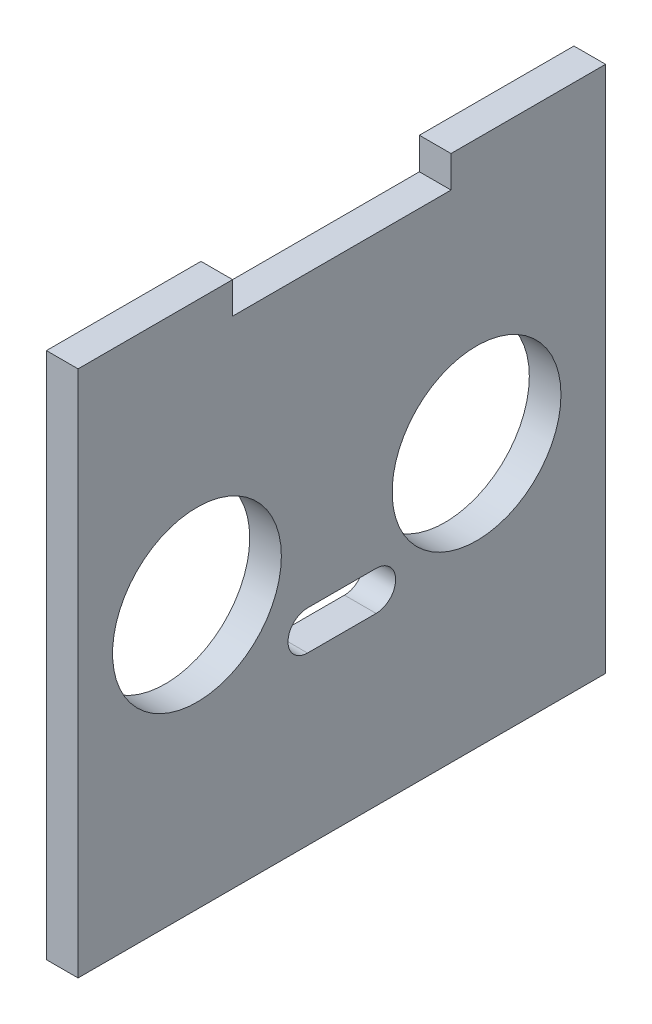
ISO-10303-21;
HEADER;
FILE_DESCRIPTION(('STEP AP214'),'2;1');
FILE_NAME('part.step','',(''),(''),'','','');
FILE_SCHEMA(('AUTOMOTIVE_DESIGN { 1 0 10303 214 1 1 1 1 }'));
ENDSEC;
DATA;
#1=APPLICATION_CONTEXT('core data for automotive mechanical design processes');
#2=APPLICATION_PROTOCOL_DEFINITION('international standard','automotive_design',2000,#1);
#3=PRODUCT_CONTEXT('',#1,'mechanical');
#4=PRODUCT('Part','Part','',(#3));
#5=PRODUCT_RELATED_PRODUCT_CATEGORY('part','',(#4));
#6=PRODUCT_DEFINITION_FORMATION('','',#4);
#7=PRODUCT_DEFINITION_CONTEXT('part definition',#1,'design');
#8=PRODUCT_DEFINITION('design','',#6,#7);
#9=PRODUCT_DEFINITION_SHAPE('','',#8);
#10=(LENGTH_UNIT() NAMED_UNIT(*) SI_UNIT(.MILLI.,.METRE.));
#11=(NAMED_UNIT(*) PLANE_ANGLE_UNIT() SI_UNIT($,.RADIAN.));
#12=(NAMED_UNIT(*) SI_UNIT($,.STERADIAN.) SOLID_ANGLE_UNIT());
#13=UNCERTAINTY_MEASURE_WITH_UNIT(LENGTH_MEASURE(1.E-05),#10,'distance_accuracy_value','');
#14=(GEOMETRIC_REPRESENTATION_CONTEXT(3) GLOBAL_UNCERTAINTY_ASSIGNED_CONTEXT((#13)) GLOBAL_UNIT_ASSIGNED_CONTEXT((#10,
#11,#12)) REPRESENTATION_CONTEXT('',''));
#15=CARTESIAN_POINT('',(0.,0.,0.));
#16=DIRECTION('',(0.,0.,1.));
#17=DIRECTION('',(1.,0.,0.));
#18=AXIS2_PLACEMENT_3D('',#15,#16,#17);
#19=CARTESIAN_POINT('',(3.,25.,-25.));
#20=DIRECTION('',(0.,0.,1.));
#21=DIRECTION('',(1.,0.,0.));
#22=AXIS2_PLACEMENT_3D('',#19,#20,#21);
#23=PLANE('',#22);
#24=DIRECTION('',(0.,1.,0.));
#25=VECTOR('',#24,1.);
#26=CARTESIAN_POINT('',(0.,25.,-25.));
#27=LINE('',#26,#25);
#28=CARTESIAN_POINT('',(0.,-25.,-25.));
#29=VERTEX_POINT('',#28);
#30=CARTESIAN_POINT('',(0.,25.,-25.));
#31=VERTEX_POINT('',#30);
#32=EDGE_CURVE('E185',#29,#31,#27,.T.);
#33=ORIENTED_EDGE('',*,*,#32,.T.);
#34=DIRECTION('',(-1.,0.,0.));
#35=VECTOR('',#34,1.);
#36=CARTESIAN_POINT('',(3.,25.,-25.));
#37=LINE('',#36,#35);
#38=CARTESIAN_POINT('',(3.,25.,-25.));
#39=VERTEX_POINT('',#38);
#40=EDGE_CURVE('E11',#39,#31,#37,.T.);
#41=ORIENTED_EDGE('',*,*,#40,.F.);
#42=DIRECTION('',(0.,1.,0.));
#43=VECTOR('',#42,1.);
#44=CARTESIAN_POINT('',(3.,25.,-25.));
#45=LINE('',#44,#43);
#46=CARTESIAN_POINT('',(3.,-25.,-25.));
#47=VERTEX_POINT('',#46);
#48=EDGE_CURVE('E166',#47,#39,#45,.T.);
#49=ORIENTED_EDGE('',*,*,#48,.F.);
#50=DIRECTION('',(-1.,0.,0.));
#51=VECTOR('',#50,1.);
#52=CARTESIAN_POINT('',(3.,-25.,-25.));
#53=LINE('',#52,#51);
#54=EDGE_CURVE('E184',#47,#29,#53,.T.);
#55=ORIENTED_EDGE('',*,*,#54,.T.);
#56=EDGE_LOOP('',(#33,#41,#49,#55));
#57=FACE_BOUND('',#56,.T.);
#58=ADVANCED_FACE('F33',(#57),#23,.F.);
#59=CARTESIAN_POINT('',(3.,25.,-10.35));
#60=DIRECTION('',(0.,-1.,0.));
#61=DIRECTION('',(0.,0.,-1.));
#62=AXIS2_PLACEMENT_3D('',#59,#60,#61);
#63=PLANE('',#62);
#64=DIRECTION('',(0.,0.,1.));
#65=VECTOR('',#64,1.);
#66=CARTESIAN_POINT('',(0.,25.,-10.35));
#67=LINE('',#66,#65);
#68=CARTESIAN_POINT('',(0.,25.,-10.35));
#69=VERTEX_POINT('',#68);
#70=EDGE_CURVE('E188',#31,#69,#67,.T.);
#71=ORIENTED_EDGE('',*,*,#70,.T.);
#72=DIRECTION('',(-1.,0.,0.));
#73=VECTOR('',#72,1.);
#74=CARTESIAN_POINT('',(3.,25.,-10.35));
#75=LINE('',#74,#73);
#76=CARTESIAN_POINT('',(3.,25.,-10.35));
#77=VERTEX_POINT('',#76);
#78=EDGE_CURVE('E40',#77,#69,#75,.T.);
#79=ORIENTED_EDGE('',*,*,#78,.F.);
#80=DIRECTION('',(0.,0.,1.));
#81=VECTOR('',#80,1.);
#82=CARTESIAN_POINT('',(3.,25.,-10.35));
#83=LINE('',#82,#81);
#84=EDGE_CURVE('E169',#39,#77,#83,.T.);
#85=ORIENTED_EDGE('',*,*,#84,.F.);
#86=ORIENTED_EDGE('',*,*,#40,.T.);
#87=EDGE_LOOP('',(#71,#79,#85,#86));
#88=FACE_BOUND('',#87,.T.);
#89=ADVANCED_FACE('F245',(#88),#63,.F.);
#90=CARTESIAN_POINT('',(3.,22.,-10.35));
#91=DIRECTION('',(0.,0.,-1.));
#92=DIRECTION('',(0.,1.,0.));
#93=AXIS2_PLACEMENT_3D('',#90,#91,#92);
#94=PLANE('',#93);
#95=DIRECTION('',(0.,-1.,0.));
#96=VECTOR('',#95,1.);
#97=CARTESIAN_POINT('',(0.,22.,-10.35));
#98=LINE('',#97,#96);
#99=CARTESIAN_POINT('',(0.,22.,-10.35));
#100=VERTEX_POINT('',#99);
#101=EDGE_CURVE('E191',#69,#100,#98,.T.);
#102=ORIENTED_EDGE('',*,*,#101,.T.);
#103=DIRECTION('',(-1.,0.,0.));
#104=VECTOR('',#103,1.);
#105=CARTESIAN_POINT('',(3.,22.,-10.35));
#106=LINE('',#105,#104);
#107=CARTESIAN_POINT('',(3.,22.,-10.35));
#108=VERTEX_POINT('',#107);
#109=EDGE_CURVE('E216',#108,#100,#106,.T.);
#110=ORIENTED_EDGE('',*,*,#109,.F.);
#111=DIRECTION('',(0.,-1.,0.));
#112=VECTOR('',#111,1.);
#113=CARTESIAN_POINT('',(3.,22.,-10.35));
#114=LINE('',#113,#112);
#115=EDGE_CURVE('E172',#77,#108,#114,.T.);
#116=ORIENTED_EDGE('',*,*,#115,.F.);
#117=ORIENTED_EDGE('',*,*,#78,.T.);
#118=EDGE_LOOP('',(#102,#110,#116,#117));
#119=FACE_BOUND('',#118,.T.);
#120=ADVANCED_FACE('F223',(#119),#94,.F.);
#121=CARTESIAN_POINT('',(3.,22.,10.35));
#122=DIRECTION('',(0.,-1.,0.));
#123=DIRECTION('',(0.,0.,-1.));
#124=AXIS2_PLACEMENT_3D('',#121,#122,#123);
#125=PLANE('',#124);
#126=DIRECTION('',(0.,0.,1.));
#127=VECTOR('',#126,1.);
#128=CARTESIAN_POINT('',(0.,22.,10.35));
#129=LINE('',#128,#127);
#130=CARTESIAN_POINT('',(0.,22.,10.35));
#131=VERTEX_POINT('',#130);
#132=EDGE_CURVE('E193',#100,#131,#129,.T.);
#133=ORIENTED_EDGE('',*,*,#132,.T.);
#134=DIRECTION('',(-1.,0.,0.));
#135=VECTOR('',#134,1.);
#136=CARTESIAN_POINT('',(3.,22.,10.35));
#137=LINE('',#136,#135);
#138=CARTESIAN_POINT('',(3.,22.,10.35));
#139=VERTEX_POINT('',#138);
#140=EDGE_CURVE('E213',#139,#131,#137,.T.);
#141=ORIENTED_EDGE('',*,*,#140,.F.);
#142=DIRECTION('',(0.,0.,1.));
#143=VECTOR('',#142,1.);
#144=CARTESIAN_POINT('',(3.,22.,10.35));
#145=LINE('',#144,#143);
#146=EDGE_CURVE('E174',#108,#139,#145,.T.);
#147=ORIENTED_EDGE('',*,*,#146,.F.);
#148=ORIENTED_EDGE('',*,*,#109,.T.);
#149=EDGE_LOOP('',(#133,#141,#147,#148));
#150=FACE_BOUND('',#149,.T.);
#151=ADVANCED_FACE('F233',(#150),#125,.F.);
#152=CARTESIAN_POINT('',(3.,25.,10.35));
#153=DIRECTION('',(0.,0.,1.));
#154=DIRECTION('',(0.,-1.,0.));
#155=AXIS2_PLACEMENT_3D('',#152,#153,#154);
#156=PLANE('',#155);
#157=DIRECTION('',(0.,1.,0.));
#158=VECTOR('',#157,1.);
#159=CARTESIAN_POINT('',(0.,25.,10.35));
#160=LINE('',#159,#158);
#161=CARTESIAN_POINT('',(0.,25.,10.35));
#162=VERTEX_POINT('',#161);
#163=EDGE_CURVE('E195',#131,#162,#160,.T.);
#164=ORIENTED_EDGE('',*,*,#163,.T.);
#165=DIRECTION('',(-1.,0.,0.));
#166=VECTOR('',#165,1.);
#167=CARTESIAN_POINT('',(3.,25.,10.35));
#168=LINE('',#167,#166);
#169=CARTESIAN_POINT('',(3.,25.,10.35));
#170=VERTEX_POINT('',#169);
#171=EDGE_CURVE('E210',#170,#162,#168,.T.);
#172=ORIENTED_EDGE('',*,*,#171,.F.);
#173=DIRECTION('',(0.,1.,0.));
#174=VECTOR('',#173,1.);
#175=CARTESIAN_POINT('',(3.,25.,10.35));
#176=LINE('',#175,#174);
#177=EDGE_CURVE('E176',#139,#170,#176,.T.);
#178=ORIENTED_EDGE('',*,*,#177,.F.);
#179=ORIENTED_EDGE('',*,*,#140,.T.);
#180=EDGE_LOOP('',(#164,#172,#178,#179));
#181=FACE_BOUND('',#180,.T.);
#182=ADVANCED_FACE('F237',(#181),#156,.F.);
#183=CARTESIAN_POINT('',(3.,25.,25.));
#184=DIRECTION('',(0.,-1.,0.));
#185=DIRECTION('',(0.,0.,-1.));
#186=AXIS2_PLACEMENT_3D('',#183,#184,#185);
#187=PLANE('',#186);
#188=DIRECTION('',(0.,0.,1.));
#189=VECTOR('',#188,1.);
#190=CARTESIAN_POINT('',(0.,25.,25.));
#191=LINE('',#190,#189);
#192=CARTESIAN_POINT('',(0.,25.,25.));
#193=VERTEX_POINT('',#192);
#194=EDGE_CURVE('E197',#162,#193,#191,.T.);
#195=ORIENTED_EDGE('',*,*,#194,.T.);
#196=DIRECTION('',(-1.,0.,0.));
#197=VECTOR('',#196,1.);
#198=CARTESIAN_POINT('',(3.,25.,25.));
#199=LINE('',#198,#197);
#200=CARTESIAN_POINT('',(3.,25.,25.));
#201=VERTEX_POINT('',#200);
#202=EDGE_CURVE('E207',#201,#193,#199,.T.);
#203=ORIENTED_EDGE('',*,*,#202,.F.);
#204=DIRECTION('',(0.,0.,1.));
#205=VECTOR('',#204,1.);
#206=CARTESIAN_POINT('',(3.,25.,25.));
#207=LINE('',#206,#205);
#208=EDGE_CURVE('E178',#170,#201,#207,.T.);
#209=ORIENTED_EDGE('',*,*,#208,.F.);
#210=ORIENTED_EDGE('',*,*,#171,.T.);
#211=EDGE_LOOP('',(#195,#203,#209,#210));
#212=FACE_BOUND('',#211,.T.);
#213=ADVANCED_FACE('F258',(#212),#187,.F.);
#214=CARTESIAN_POINT('',(3.,25.,25.));
#215=DIRECTION('',(0.,0.,-1.));
#216=DIRECTION('',(-1.,0.,0.));
#217=AXIS2_PLACEMENT_3D('',#214,#215,#216);
#218=PLANE('',#217);
#219=DIRECTION('',(0.,-1.,0.));
#220=VECTOR('',#219,1.);
#221=CARTESIAN_POINT('',(0.,25.,25.));
#222=LINE('',#221,#220);
#223=CARTESIAN_POINT('',(0.,-25.,25.));
#224=VERTEX_POINT('',#223);
#225=EDGE_CURVE('E199',#193,#224,#222,.T.);
#226=ORIENTED_EDGE('',*,*,#225,.T.);
#227=DIRECTION('',(-1.,0.,0.));
#228=VECTOR('',#227,1.);
#229=CARTESIAN_POINT('',(3.,-25.,25.));
#230=LINE('',#229,#228);
#231=CARTESIAN_POINT('',(3.,-25.,25.));
#232=VERTEX_POINT('',#231);
#233=EDGE_CURVE('E204',#232,#224,#230,.T.);
#234=ORIENTED_EDGE('',*,*,#233,.F.);
#235=DIRECTION('',(0.,-1.,0.));
#236=VECTOR('',#235,1.);
#237=CARTESIAN_POINT('',(3.,25.,25.));
#238=LINE('',#237,#236);
#239=EDGE_CURVE('E180',#201,#232,#238,.T.);
#240=ORIENTED_EDGE('',*,*,#239,.F.);
#241=ORIENTED_EDGE('',*,*,#202,.T.);
#242=EDGE_LOOP('',(#226,#234,#240,#241));
#243=FACE_BOUND('',#242,.T.);
#244=ADVANCED_FACE('F256',(#243),#218,.F.);
#245=CARTESIAN_POINT('',(3.,-25.,25.));
#246=DIRECTION('',(0.,1.,0.));
#247=DIRECTION('',(0.,0.,1.));
#248=AXIS2_PLACEMENT_3D('',#245,#246,#247);
#249=PLANE('',#248);
#250=DIRECTION('',(0.,0.,-1.));
#251=VECTOR('',#250,1.);
#252=CARTESIAN_POINT('',(0.,-25.,25.));
#253=LINE('',#252,#251);
#254=EDGE_CURVE('E170',#224,#29,#253,.T.);
#255=ORIENTED_EDGE('',*,*,#254,.T.);
#256=ORIENTED_EDGE('',*,*,#54,.F.);
#257=DIRECTION('',(0.,0.,-1.));
#258=VECTOR('',#257,1.);
#259=CARTESIAN_POINT('',(3.,-25.,25.));
#260=LINE('',#259,#258);
#261=EDGE_CURVE('E182',#232,#47,#260,.T.);
#262=ORIENTED_EDGE('',*,*,#261,.F.);
#263=ORIENTED_EDGE('',*,*,#233,.T.);
#264=EDGE_LOOP('',(#255,#256,#262,#263));
#265=FACE_BOUND('',#264,.T.);
#266=ADVANCED_FACE('F251',(#265),#249,.F.);
#267=CARTESIAN_POINT('',(3.,0.,0.));
#268=DIRECTION('',(1.,0.,0.));
#269=DIRECTION('',(0.,0.,-1.));
#270=AXIS2_PLACEMENT_3D('',#267,#268,#269);
#271=PLANE('',#270);
#272=CARTESIAN_POINT('',(3.,0.,13.73));
#273=DIRECTION('',(1.,0.,0.));
#274=DIRECTION('',(0.,0.,-1.));
#275=AXIS2_PLACEMENT_3D('',#272,#273,#274);
#276=CIRCLE('',#275,8.);
#277=CARTESIAN_POINT('',(3.,0.,5.73));
#278=VERTEX_POINT('',#277);
#279=EDGE_CURVE('E145',#278,#278,#276,.T.);
#280=ORIENTED_EDGE('',*,*,#279,.F.);
#281=EDGE_LOOP('',(#280));
#282=FACE_BOUND('',#281,.T.);
#283=CARTESIAN_POINT('',(3.,-7.35,3.25));
#284=DIRECTION('',(1.,0.,0.));
#285=DIRECTION('',(0.,0.,-1.));
#286=AXIS2_PLACEMENT_3D('',#283,#284,#285);
#287=CIRCLE('',#286,1.85);
#288=CARTESIAN_POINT('',(3.,-5.5,3.25));
#289=VERTEX_POINT('',#288);
#290=CARTESIAN_POINT('',(3.,-9.2,3.25));
#291=VERTEX_POINT('',#290);
#292=EDGE_CURVE('E47',#289,#291,#287,.T.);
#293=ORIENTED_EDGE('',*,*,#292,.F.);
#294=DIRECTION('',(0.,0.,1.));
#295=VECTOR('',#294,1.);
#296=CARTESIAN_POINT('',(3.,-5.5,3.25));
#297=LINE('',#296,#295);
#298=CARTESIAN_POINT('',(3.,-5.5,-3.25));
#299=VERTEX_POINT('',#298);
#300=EDGE_CURVE('E139',#299,#289,#297,.T.);
#301=ORIENTED_EDGE('',*,*,#300,.F.);
#302=CARTESIAN_POINT('',(3.,-7.35,-3.25));
#303=DIRECTION('',(1.,0.,0.));
#304=DIRECTION('',(0.,0.,-1.));
#305=AXIS2_PLACEMENT_3D('',#302,#303,#304);
#306=CIRCLE('',#305,1.85);
#307=CARTESIAN_POINT('',(3.,-9.2,-3.25));
#308=VERTEX_POINT('',#307);
#309=EDGE_CURVE('E142',#308,#299,#306,.T.);
#310=ORIENTED_EDGE('',*,*,#309,.F.);
#311=DIRECTION('',(0.,0.,-1.));
#312=VECTOR('',#311,1.);
#313=CARTESIAN_POINT('',(3.,-9.2,3.25));
#314=LINE('',#313,#312);
#315=EDGE_CURVE('E151',#291,#308,#314,.T.);
#316=ORIENTED_EDGE('',*,*,#315,.F.);
#317=EDGE_LOOP('',(#293,#301,#310,#316));
#318=FACE_BOUND('',#317,.T.);
#319=CARTESIAN_POINT('',(3.,0.,-12.77));
#320=DIRECTION('',(1.,0.,0.));
#321=DIRECTION('',(0.,0.,-1.));
#322=AXIS2_PLACEMENT_3D('',#319,#320,#321);
#323=CIRCLE('',#322,8.);
#324=CARTESIAN_POINT('',(3.,0.,-20.77));
#325=VERTEX_POINT('',#324);
#326=EDGE_CURVE('E157',#325,#325,#323,.T.);
#327=ORIENTED_EDGE('',*,*,#326,.F.);
#328=EDGE_LOOP('',(#327));
#329=FACE_BOUND('',#328,.T.);
#330=ORIENTED_EDGE('',*,*,#48,.T.);
#331=ORIENTED_EDGE('',*,*,#84,.T.);
#332=ORIENTED_EDGE('',*,*,#115,.T.);
#333=ORIENTED_EDGE('',*,*,#146,.T.);
#334=ORIENTED_EDGE('',*,*,#177,.T.);
#335=ORIENTED_EDGE('',*,*,#208,.T.);
#336=ORIENTED_EDGE('',*,*,#239,.T.);
#337=ORIENTED_EDGE('',*,*,#261,.T.);
#338=EDGE_LOOP('',(#330,#331,#332,#333,#334,#335,#336,#337));
#339=FACE_BOUND('',#338,.T.);
#340=ADVANCED_FACE('F241',(#282,#318,#329,#339),#271,.T.);
#341=CARTESIAN_POINT('',(0.,0.,0.));
#342=DIRECTION('',(1.,0.,0.));
#343=DIRECTION('',(0.,0.,-1.));
#344=AXIS2_PLACEMENT_3D('',#341,#342,#343);
#345=PLANE('',#344);
#346=CARTESIAN_POINT('',(0.,0.,13.73));
#347=DIRECTION('',(1.,0.,0.));
#348=DIRECTION('',(0.,0.,-1.));
#349=AXIS2_PLACEMENT_3D('',#346,#347,#348);
#350=CIRCLE('',#349,8.);
#351=CARTESIAN_POINT('',(0.,0.,5.73));
#352=VERTEX_POINT('',#351);
#353=EDGE_CURVE('E189',#352,#352,#350,.T.);
#354=ORIENTED_EDGE('',*,*,#353,.T.);
#355=EDGE_LOOP('',(#354));
#356=FACE_BOUND('',#355,.T.);
#357=DIRECTION('',(0.,0.,1.));
#358=VECTOR('',#357,1.);
#359=CARTESIAN_POINT('',(0.,-5.5,3.25));
#360=LINE('',#359,#358);
#361=CARTESIAN_POINT('',(0.,-5.5,-3.25));
#362=VERTEX_POINT('',#361);
#363=CARTESIAN_POINT('',(0.,-5.5,3.25));
#364=VERTEX_POINT('',#363);
#365=EDGE_CURVE('E129',#362,#364,#360,.T.);
#366=ORIENTED_EDGE('',*,*,#365,.T.);
#367=CARTESIAN_POINT('',(0.,-7.35,3.25));
#368=DIRECTION('',(1.,0.,0.));
#369=DIRECTION('',(0.,0.,-1.));
#370=AXIS2_PLACEMENT_3D('',#367,#368,#369);
#371=CIRCLE('',#370,1.85);
#372=CARTESIAN_POINT('',(0.,-9.2,3.25));
#373=VERTEX_POINT('',#372);
#374=EDGE_CURVE('E123',#364,#373,#371,.T.);
#375=ORIENTED_EDGE('',*,*,#374,.T.);
#376=DIRECTION('',(0.,0.,-1.));
#377=VECTOR('',#376,1.);
#378=CARTESIAN_POINT('',(0.,-9.2,3.25));
#379=LINE('',#378,#377);
#380=CARTESIAN_POINT('',(0.,-9.2,-3.25));
#381=VERTEX_POINT('',#380);
#382=EDGE_CURVE('E132',#373,#381,#379,.T.);
#383=ORIENTED_EDGE('',*,*,#382,.T.);
#384=CARTESIAN_POINT('',(0.,-7.35,-3.25));
#385=DIRECTION('',(1.,0.,0.));
#386=DIRECTION('',(0.,0.,-1.));
#387=AXIS2_PLACEMENT_3D('',#384,#385,#386);
#388=CIRCLE('',#387,1.85);
#389=EDGE_CURVE('E55',#381,#362,#388,.T.);
#390=ORIENTED_EDGE('',*,*,#389,.T.);
#391=EDGE_LOOP('',(#366,#375,#383,#390));
#392=FACE_BOUND('',#391,.T.);
#393=CARTESIAN_POINT('',(0.,0.,-12.77));
#394=DIRECTION('',(1.,0.,0.));
#395=DIRECTION('',(0.,0.,-1.));
#396=AXIS2_PLACEMENT_3D('',#393,#394,#395);
#397=CIRCLE('',#396,8.);
#398=CARTESIAN_POINT('',(0.,0.,-20.77));
#399=VERTEX_POINT('',#398);
#400=EDGE_CURVE('E161',#399,#399,#397,.T.);
#401=ORIENTED_EDGE('',*,*,#400,.T.);
#402=EDGE_LOOP('',(#401));
#403=FACE_BOUND('',#402,.T.);
#404=ORIENTED_EDGE('',*,*,#32,.F.);
#405=ORIENTED_EDGE('',*,*,#254,.F.);
#406=ORIENTED_EDGE('',*,*,#225,.F.);
#407=ORIENTED_EDGE('',*,*,#194,.F.);
#408=ORIENTED_EDGE('',*,*,#163,.F.);
#409=ORIENTED_EDGE('',*,*,#132,.F.);
#410=ORIENTED_EDGE('',*,*,#101,.F.);
#411=ORIENTED_EDGE('',*,*,#70,.F.);
#412=EDGE_LOOP('',(#404,#405,#406,#407,#408,#409,#410,#411));
#413=FACE_BOUND('',#412,.T.);
#414=ADVANCED_FACE('F136',(#356,#392,#403,#413),#345,.F.);
#415=CARTESIAN_POINT('',(0.,0.,-12.77));
#416=DIRECTION('',(1.,0.,0.));
#417=DIRECTION('',(0.,0.,-1.));
#418=AXIS2_PLACEMENT_3D('',#415,#416,#417);
#419=CYLINDRICAL_SURFACE('',#418,8.);
#420=ORIENTED_EDGE('',*,*,#400,.F.);
#421=EDGE_LOOP('',(#420));
#422=FACE_BOUND('',#421,.T.);
#423=ORIENTED_EDGE('',*,*,#326,.T.);
#424=EDGE_LOOP('',(#423));
#425=FACE_BOUND('',#424,.T.);
#426=ADVANCED_FACE('F321',(#422,#425),#419,.F.);
#427=CARTESIAN_POINT('',(0.,-7.35,3.25));
#428=DIRECTION('',(1.,0.,0.));
#429=DIRECTION('',(0.,0.,-1.));
#430=AXIS2_PLACEMENT_3D('',#427,#428,#429);
#431=CYLINDRICAL_SURFACE('',#430,1.85);
#432=ORIENTED_EDGE('',*,*,#292,.T.);
#433=DIRECTION('',(1.,0.,0.));
#434=VECTOR('',#433,1.);
#435=CARTESIAN_POINT('',(0.,-9.2,3.25));
#436=LINE('',#435,#434);
#437=EDGE_CURVE('E119',#373,#291,#436,.T.);
#438=ORIENTED_EDGE('',*,*,#437,.F.);
#439=ORIENTED_EDGE('',*,*,#374,.F.);
#440=DIRECTION('',(1.,0.,0.));
#441=VECTOR('',#440,1.);
#442=CARTESIAN_POINT('',(0.,-5.5,3.25));
#443=LINE('',#442,#441);
#444=EDGE_CURVE('E155',#364,#289,#443,.T.);
#445=ORIENTED_EDGE('',*,*,#444,.T.);
#446=EDGE_LOOP('',(#432,#438,#439,#445));
#447=FACE_BOUND('',#446,.T.);
#448=ADVANCED_FACE('F121',(#447),#431,.F.);
#449=CARTESIAN_POINT('',(0.,-5.5,3.25));
#450=DIRECTION('',(0.,1.,0.));
#451=DIRECTION('',(0.,0.,1.));
#452=AXIS2_PLACEMENT_3D('',#449,#450,#451);
#453=PLANE('',#452);
#454=ORIENTED_EDGE('',*,*,#300,.T.);
#455=ORIENTED_EDGE('',*,*,#444,.F.);
#456=ORIENTED_EDGE('',*,*,#365,.F.);
#457=DIRECTION('',(1.,0.,0.));
#458=VECTOR('',#457,1.);
#459=CARTESIAN_POINT('',(0.,-5.5,-3.25));
#460=LINE('',#459,#458);
#461=EDGE_CURVE('E158',#362,#299,#460,.T.);
#462=ORIENTED_EDGE('',*,*,#461,.T.);
#463=EDGE_LOOP('',(#454,#455,#456,#462));
#464=FACE_BOUND('',#463,.T.);
#465=ADVANCED_FACE('F340',(#464),#453,.F.);
#466=CARTESIAN_POINT('',(0.,-7.35,-3.25));
#467=DIRECTION('',(1.,0.,0.));
#468=DIRECTION('',(0.,0.,-1.));
#469=AXIS2_PLACEMENT_3D('',#466,#467,#468);
#470=CYLINDRICAL_SURFACE('',#469,1.85);
#471=ORIENTED_EDGE('',*,*,#309,.T.);
#472=ORIENTED_EDGE('',*,*,#461,.F.);
#473=ORIENTED_EDGE('',*,*,#389,.F.);
#474=DIRECTION('',(1.,0.,0.));
#475=VECTOR('',#474,1.);
#476=CARTESIAN_POINT('',(0.,-9.2,-3.25));
#477=LINE('',#476,#475);
#478=EDGE_CURVE('E128',#381,#308,#477,.T.);
#479=ORIENTED_EDGE('',*,*,#478,.T.);
#480=EDGE_LOOP('',(#471,#472,#473,#479));
#481=FACE_BOUND('',#480,.T.);
#482=ADVANCED_FACE('F349',(#481),#470,.F.);
#483=CARTESIAN_POINT('',(0.,-9.2,3.25));
#484=DIRECTION('',(0.,-1.,0.));
#485=DIRECTION('',(0.,0.,-1.));
#486=AXIS2_PLACEMENT_3D('',#483,#484,#485);
#487=PLANE('',#486);
#488=ORIENTED_EDGE('',*,*,#315,.T.);
#489=ORIENTED_EDGE('',*,*,#478,.F.);
#490=ORIENTED_EDGE('',*,*,#382,.F.);
#491=ORIENTED_EDGE('',*,*,#437,.T.);
#492=EDGE_LOOP('',(#488,#489,#490,#491));
#493=FACE_BOUND('',#492,.T.);
#494=ADVANCED_FACE('F133',(#493),#487,.F.);
#495=CARTESIAN_POINT('',(0.,0.,13.73));
#496=DIRECTION('',(1.,0.,0.));
#497=DIRECTION('',(0.,0.,-1.));
#498=AXIS2_PLACEMENT_3D('',#495,#496,#497);
#499=CYLINDRICAL_SURFACE('',#498,8.);
#500=ORIENTED_EDGE('',*,*,#353,.F.);
#501=EDGE_LOOP('',(#500));
#502=FACE_BOUND('',#501,.T.);
#503=ORIENTED_EDGE('',*,*,#279,.T.);
#504=EDGE_LOOP('',(#503));
#505=FACE_BOUND('',#504,.T.);
#506=ADVANCED_FACE('F367',(#502,#505),#499,.F.);
#507=CLOSED_SHELL('',(#58,#89,#120,#151,#182,#213,#244,#266,#340,#414,#426,#448,#465,#482,#494,#506));
#508=MANIFOLD_SOLID_BREP('B2',#507);
#509=ADVANCED_BREP_SHAPE_REPRESENTATION('',(#18,#508),#14);
#510=SHAPE_DEFINITION_REPRESENTATION(#9,#509);
ENDSEC;
END-ISO-10303-21;
